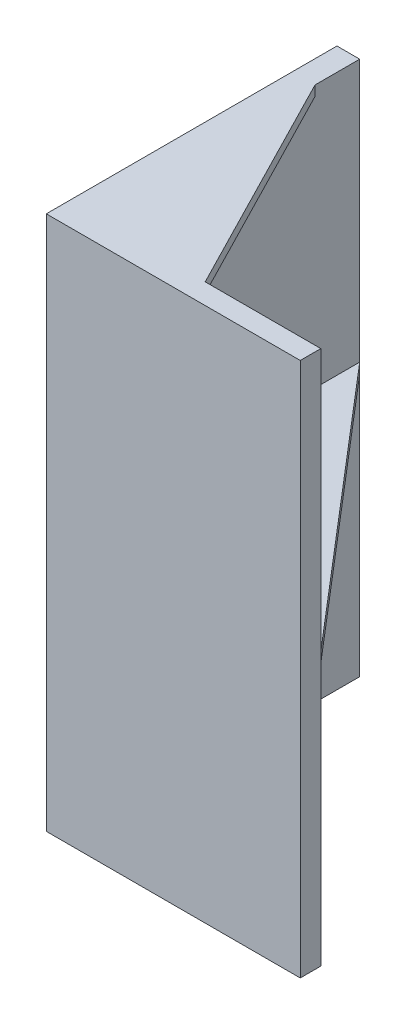
ISO-10303-21;
HEADER;
FILE_DESCRIPTION(('STEP AP214'),'2;1');
FILE_NAME('part.step','',(''),(''),'','','');
FILE_SCHEMA(('AUTOMOTIVE_DESIGN { 1 0 10303 214 1 1 1 1 }'));
ENDSEC;
DATA;
#1=APPLICATION_CONTEXT('core data for automotive mechanical design processes');
#2=APPLICATION_PROTOCOL_DEFINITION('international standard','automotive_design',2000,#1);
#3=PRODUCT_CONTEXT('',#1,'mechanical');
#4=PRODUCT('Part','Part','',(#3));
#5=PRODUCT_RELATED_PRODUCT_CATEGORY('part','',(#4));
#6=PRODUCT_DEFINITION_FORMATION('','',#4);
#7=PRODUCT_DEFINITION_CONTEXT('part definition',#1,'design');
#8=PRODUCT_DEFINITION('design','',#6,#7);
#9=PRODUCT_DEFINITION_SHAPE('','',#8);
#10=(LENGTH_UNIT() NAMED_UNIT(*) SI_UNIT(.MILLI.,.METRE.));
#11=(NAMED_UNIT(*) PLANE_ANGLE_UNIT() SI_UNIT($,.RADIAN.));
#12=(NAMED_UNIT(*) SI_UNIT($,.STERADIAN.) SOLID_ANGLE_UNIT());
#13=UNCERTAINTY_MEASURE_WITH_UNIT(LENGTH_MEASURE(1.E-05),#10,'distance_accuracy_value','');
#14=(GEOMETRIC_REPRESENTATION_CONTEXT(3) GLOBAL_UNCERTAINTY_ASSIGNED_CONTEXT((#13)) GLOBAL_UNIT_ASSIGNED_CONTEXT((#10,
#11,#12)) REPRESENTATION_CONTEXT('',''));
#15=CARTESIAN_POINT('',(0.,0.,0.));
#16=DIRECTION('',(0.,0.,1.));
#17=DIRECTION('',(1.,0.,0.));
#18=AXIS2_PLACEMENT_3D('',#15,#16,#17);
#19=CARTESIAN_POINT('',(0.,-135.89,-77.9555013680354));
#20=DIRECTION('',(1.,0.,0.));
#21=DIRECTION('',(0.,0.,-1.));
#22=AXIS2_PLACEMENT_3D('',#19,#20,#21);
#23=PLANE('',#22);
#24=DIRECTION('',(0.,1.,0.));
#25=VECTOR('',#24,1.);
#26=CARTESIAN_POINT('',(0.,-135.89,-77.9555013680354));
#27=LINE('',#26,#25);
#28=CARTESIAN_POINT('',(0.,-135.89,-77.9555013680354));
#29=VERTEX_POINT('',#28);
#30=CARTESIAN_POINT('',(0.,-2.53999999999999,-77.9555013680354));
#31=VERTEX_POINT('',#30);
#32=EDGE_CURVE('E42',#29,#31,#27,.T.);
#33=ORIENTED_EDGE('',*,*,#32,.T.);
#34=DIRECTION('',(0.,0.,1.));
#35=VECTOR('',#34,1.);
#36=CARTESIAN_POINT('',(0.,-2.53999999999999,-77.9555013680354));
#37=LINE('',#36,#35);
#38=CARTESIAN_POINT('',(0.,-2.53999999999999,59.3058598924289));
#39=VERTEX_POINT('',#38);
#40=EDGE_CURVE('E118',#31,#39,#37,.T.);
#41=ORIENTED_EDGE('',*,*,#40,.T.);
#42=DIRECTION('',(0.,1.,0.));
#43=VECTOR('',#42,1.);
#44=CARTESIAN_POINT('',(0.,-135.89,59.3058598924289));
#45=LINE('',#44,#43);
#46=CARTESIAN_POINT('',(0.,-135.89,59.3058598924289));
#47=VERTEX_POINT('',#46);
#48=EDGE_CURVE('E149',#47,#39,#45,.T.);
#49=ORIENTED_EDGE('',*,*,#48,.F.);
#50=DIRECTION('',(0.,0.,-1.));
#51=VECTOR('',#50,1.);
#52=CARTESIAN_POINT('',(0.,-135.89,-77.9555013680354));
#53=LINE('',#52,#51);
#54=EDGE_CURVE('E146',#47,#29,#53,.T.);
#55=ORIENTED_EDGE('',*,*,#54,.T.);
#56=EDGE_LOOP('',(#33,#41,#49,#55));
#57=FACE_BOUND('',#56,.T.);
#58=ADVANCED_FACE('F33',(#57),#23,.T.);
#59=CARTESIAN_POINT('',(0.,-135.89,59.3058598924289));
#60=DIRECTION('',(0.,0.,-1.));
#61=DIRECTION('',(-1.,0.,0.));
#62=AXIS2_PLACEMENT_3D('',#59,#60,#61);
#63=PLANE('',#62);
#64=ORIENTED_EDGE('',*,*,#48,.T.);
#65=DIRECTION('',(1.,0.,0.));
#66=VECTOR('',#65,1.);
#67=CARTESIAN_POINT('',(0.,-2.53999999999999,59.3058598924289));
#68=LINE('',#67,#66);
#69=CARTESIAN_POINT('',(117.492741296321,-2.53999999999999,59.3058598924289));
#70=VERTEX_POINT('',#69);
#71=EDGE_CURVE('E123',#39,#70,#68,.T.);
#72=ORIENTED_EDGE('',*,*,#71,.T.);
#73=DIRECTION('',(0.,1.,0.));
#74=VECTOR('',#73,1.);
#75=CARTESIAN_POINT('',(117.492741296321,-135.89,59.3058598924289));
#76=LINE('',#75,#74);
#77=CARTESIAN_POINT('',(117.492741296321,-135.89,59.3058598924289));
#78=VERTEX_POINT('',#77);
#79=EDGE_CURVE('E154',#78,#70,#76,.T.);
#80=ORIENTED_EDGE('',*,*,#79,.F.);
#81=DIRECTION('',(-1.,0.,0.));
#82=VECTOR('',#81,1.);
#83=CARTESIAN_POINT('',(0.,-135.89,59.3058598924289));
#84=LINE('',#83,#82);
#85=EDGE_CURVE('E168',#78,#47,#84,.T.);
#86=ORIENTED_EDGE('',*,*,#85,.T.);
#87=EDGE_LOOP('',(#64,#72,#80,#86));
#88=FACE_BOUND('',#87,.T.);
#89=ADVANCED_FACE('F198',(#88),#63,.T.);
#90=CARTESIAN_POINT('',(-11.5627777148761,-135.89,-77.9555013680354));
#91=DIRECTION('',(0.,0.,-1.));
#92=DIRECTION('',(-1.,0.,0.));
#93=AXIS2_PLACEMENT_3D('',#90,#91,#92);
#94=PLANE('',#93);
#95=CARTESIAN_POINT('',(0.,2.53999999999999,-77.9555013680354));
#96=VERTEX_POINT('',#95);
#97=CARTESIAN_POINT('',(0.,135.89,-77.9555013680354));
#98=VERTEX_POINT('',#97);
#99=EDGE_CURVE('E141',#96,#98,#27,.T.);
#100=ORIENTED_EDGE('',*,*,#99,.F.);
#101=DIRECTION('',(0.,-1.,0.));
#102=VECTOR('',#101,1.);
#103=CARTESIAN_POINT('',(0.,-135.89,-77.9555013680354));
#104=LINE('',#103,#102);
#105=EDGE_CURVE('E131',#31,#96,#104,.F.);
#106=ORIENTED_EDGE('',*,*,#105,.F.);
#107=ORIENTED_EDGE('',*,*,#32,.F.);
#108=DIRECTION('',(-1.,0.,0.));
#109=VECTOR('',#108,1.);
#110=CARTESIAN_POINT('',(-11.5627777148761,-135.89,-77.9555013680354));
#111=LINE('',#110,#109);
#112=CARTESIAN_POINT('',(-11.5627777148761,-135.89,-77.9555013680354));
#113=VERTEX_POINT('',#112);
#114=EDGE_CURVE('E162',#29,#113,#111,.T.);
#115=ORIENTED_EDGE('',*,*,#114,.T.);
#116=DIRECTION('',(0.,1.,0.));
#117=VECTOR('',#116,1.);
#118=CARTESIAN_POINT('',(-11.5627777148761,-135.89,-77.9555013680354));
#119=LINE('',#118,#117);
#120=CARTESIAN_POINT('',(-11.5627777148761,135.89,-77.9555013680354));
#121=VERTEX_POINT('',#120);
#122=EDGE_CURVE('E11',#113,#121,#119,.T.);
#123=ORIENTED_EDGE('',*,*,#122,.T.);
#124=DIRECTION('',(-1.,0.,0.));
#125=VECTOR('',#124,1.);
#126=CARTESIAN_POINT('',(-11.5627777148761,135.89,-77.9555013680354));
#127=LINE('',#126,#125);
#128=EDGE_CURVE('E183',#98,#121,#127,.T.);
#129=ORIENTED_EDGE('',*,*,#128,.F.);
#130=EDGE_LOOP('',(#100,#106,#107,#115,#123,#129));
#131=FACE_BOUND('',#130,.T.);
#132=ADVANCED_FACE('F137',(#131),#94,.T.);
#133=DIRECTION('',(0.,0.,1.));
#134=VECTOR('',#133,1.);
#135=CARTESIAN_POINT('',(0.,2.53999999999999,-77.9555013680354));
#136=LINE('',#135,#134);
#137=CARTESIAN_POINT('',(0.,2.53999999999999,59.3058598924289));
#138=VERTEX_POINT('',#137);
#139=EDGE_CURVE('E143',#96,#138,#136,.T.);
#140=ORIENTED_EDGE('',*,*,#139,.F.);
#141=ORIENTED_EDGE('',*,*,#99,.T.);
#142=DIRECTION('',(0.,0.,-1.));
#143=VECTOR('',#142,1.);
#144=CARTESIAN_POINT('',(0.,135.89,-77.9555013680354));
#145=LINE('',#144,#143);
#146=CARTESIAN_POINT('',(0.,135.89,-55.2334176384974));
#147=VERTEX_POINT('',#146);
#148=EDGE_CURVE('E182',#147,#98,#145,.T.);
#149=ORIENTED_EDGE('',*,*,#148,.F.);
#150=DIRECTION('',(0.,-1.,0.));
#151=VECTOR('',#150,1.);
#152=CARTESIAN_POINT('',(0.,-135.89,-55.2334176384974));
#153=LINE('',#152,#151);
#154=CARTESIAN_POINT('',(0.,130.81,-55.2334176384974));
#155=VERTEX_POINT('',#154);
#156=EDGE_CURVE('E246',#155,#147,#153,.F.);
#157=ORIENTED_EDGE('',*,*,#156,.F.);
#158=DIRECTION('',(0.,0.,1.));
#159=VECTOR('',#158,1.);
#160=CARTESIAN_POINT('',(0.,130.81,-77.9555013680354));
#161=LINE('',#160,#159);
#162=CARTESIAN_POINT('',(0.,130.81,59.3058598924289));
#163=VERTEX_POINT('',#162);
#164=EDGE_CURVE('E175',#155,#163,#161,.T.);
#165=ORIENTED_EDGE('',*,*,#164,.T.);
#166=EDGE_CURVE('E153',#138,#163,#45,.T.);
#167=ORIENTED_EDGE('',*,*,#166,.F.);
#168=EDGE_LOOP('',(#140,#141,#149,#157,#165,#167));
#169=FACE_BOUND('',#168,.T.);
#170=ADVANCED_FACE('F219',(#169),#23,.T.);
#171=DIRECTION('',(1.,0.,0.));
#172=VECTOR('',#171,1.);
#173=CARTESIAN_POINT('',(0.,2.53999999999999,59.3058598924289));
#174=LINE('',#173,#172);
#175=CARTESIAN_POINT('',(117.492741296321,2.53999999999999,59.3058598924289));
#176=VERTEX_POINT('',#175);
#177=EDGE_CURVE('E127',#138,#176,#174,.T.);
#178=ORIENTED_EDGE('',*,*,#177,.F.);
#179=ORIENTED_EDGE('',*,*,#166,.T.);
#180=DIRECTION('',(1.,0.,0.));
#181=VECTOR('',#180,1.);
#182=CARTESIAN_POINT('',(0.,130.81,59.3058598924289));
#183=LINE('',#182,#181);
#184=CARTESIAN_POINT('',(58.7463706481607,130.81,59.3058598924289));
#185=VERTEX_POINT('',#184);
#186=EDGE_CURVE('E247',#163,#185,#183,.T.);
#187=ORIENTED_EDGE('',*,*,#186,.T.);
#188=DIRECTION('',(0.,1.,0.));
#189=VECTOR('',#188,1.);
#190=CARTESIAN_POINT('',(58.7463706481607,-135.89,59.3058598924289));
#191=LINE('',#190,#189);
#192=CARTESIAN_POINT('',(58.7463706481607,135.89,59.3058598924289));
#193=VERTEX_POINT('',#192);
#194=EDGE_CURVE('E242',#193,#185,#191,.F.);
#195=ORIENTED_EDGE('',*,*,#194,.F.);
#196=DIRECTION('',(-1.,0.,0.));
#197=VECTOR('',#196,1.);
#198=CARTESIAN_POINT('',(0.,135.89,59.3058598924289));
#199=LINE('',#198,#197);
#200=CARTESIAN_POINT('',(117.492741296321,135.89,59.3058598924289));
#201=VERTEX_POINT('',#200);
#202=EDGE_CURVE('E180',#201,#193,#199,.T.);
#203=ORIENTED_EDGE('',*,*,#202,.F.);
#204=EDGE_CURVE('E156',#176,#201,#76,.T.);
#205=ORIENTED_EDGE('',*,*,#204,.F.);
#206=EDGE_LOOP('',(#178,#179,#187,#195,#203,#205));
#207=FACE_BOUND('',#206,.T.);
#208=ADVANCED_FACE('F215',(#207),#63,.T.);
#209=CARTESIAN_POINT('',(117.492741296321,-135.89,59.3058598924289));
#210=DIRECTION('',(1.,0.,0.));
#211=DIRECTION('',(0.,0.,-1.));
#212=AXIS2_PLACEMENT_3D('',#209,#210,#211);
#213=PLANE('',#212);
#214=DIRECTION('',(0.,0.,-1.));
#215=VECTOR('',#214,1.);
#216=CARTESIAN_POINT('',(117.492741296321,135.89,59.3058598924289));
#217=LINE('',#216,#215);
#218=CARTESIAN_POINT('',(117.492741296321,135.89,69.7496591187686));
#219=VERTEX_POINT('',#218);
#220=EDGE_CURVE('E177',#219,#201,#217,.T.);
#221=ORIENTED_EDGE('',*,*,#220,.F.);
#222=DIRECTION('',(0.,1.,0.));
#223=VECTOR('',#222,1.);
#224=CARTESIAN_POINT('',(117.492741296321,-135.89,69.7496591187686));
#225=LINE('',#224,#223);
#226=CARTESIAN_POINT('',(117.492741296321,-135.89,69.7496591187686));
#227=VERTEX_POINT('',#226);
#228=EDGE_CURVE('E157',#227,#219,#225,.T.);
#229=ORIENTED_EDGE('',*,*,#228,.F.);
#230=DIRECTION('',(0.,0.,-1.));
#231=VECTOR('',#230,1.);
#232=CARTESIAN_POINT('',(117.492741296321,-135.89,59.3058598924289));
#233=LINE('',#232,#231);
#234=EDGE_CURVE('E189',#227,#78,#233,.T.);
#235=ORIENTED_EDGE('',*,*,#234,.T.);
#236=ORIENTED_EDGE('',*,*,#79,.T.);
#237=EDGE_CURVE('E133',#70,#176,#76,.T.);
#238=ORIENTED_EDGE('',*,*,#237,.T.);
#239=ORIENTED_EDGE('',*,*,#204,.T.);
#240=EDGE_LOOP('',(#221,#229,#235,#236,#238,#239));
#241=FACE_BOUND('',#240,.T.);
#242=ADVANCED_FACE('F205',(#241),#213,.T.);
#243=CARTESIAN_POINT('',(-11.5627777148761,-135.89,69.7496591187686));
#244=DIRECTION('',(0.,0.,1.));
#245=DIRECTION('',(1.,0.,0.));
#246=AXIS2_PLACEMENT_3D('',#243,#244,#245);
#247=PLANE('',#246);
#248=DIRECTION('',(1.,0.,0.));
#249=VECTOR('',#248,1.);
#250=CARTESIAN_POINT('',(-11.5627777148761,135.89,69.7496591187686));
#251=LINE('',#250,#249);
#252=CARTESIAN_POINT('',(-11.5627777148761,135.89,69.7496591187686));
#253=VERTEX_POINT('',#252);
#254=EDGE_CURVE('E174',#253,#219,#251,.T.);
#255=ORIENTED_EDGE('',*,*,#254,.F.);
#256=DIRECTION('',(0.,1.,0.));
#257=VECTOR('',#256,1.);
#258=CARTESIAN_POINT('',(-11.5627777148761,-135.89,69.7496591187686));
#259=LINE('',#258,#257);
#260=CARTESIAN_POINT('',(-11.5627777148761,-135.89,69.7496591187686));
#261=VERTEX_POINT('',#260);
#262=EDGE_CURVE('E37',#261,#253,#259,.T.);
#263=ORIENTED_EDGE('',*,*,#262,.F.);
#264=DIRECTION('',(1.,0.,0.));
#265=VECTOR('',#264,1.);
#266=CARTESIAN_POINT('',(-11.5627777148761,-135.89,69.7496591187686));
#267=LINE('',#266,#265);
#268=EDGE_CURVE('E186',#261,#227,#267,.T.);
#269=ORIENTED_EDGE('',*,*,#268,.T.);
#270=ORIENTED_EDGE('',*,*,#228,.T.);
#271=EDGE_LOOP('',(#255,#263,#269,#270));
#272=FACE_BOUND('',#271,.T.);
#273=ADVANCED_FACE('F209',(#272),#247,.T.);
#274=CARTESIAN_POINT('',(-11.5627777148761,-135.89,59.3058598924289));
#275=DIRECTION('',(-1.,0.,0.));
#276=DIRECTION('',(0.,0.,1.));
#277=AXIS2_PLACEMENT_3D('',#274,#275,#276);
#278=PLANE('',#277);
#279=DIRECTION('',(0.,0.,1.));
#280=VECTOR('',#279,1.);
#281=CARTESIAN_POINT('',(-11.5627777148761,135.89,59.3058598924289));
#282=LINE('',#281,#280);
#283=EDGE_CURVE('E172',#121,#253,#282,.T.);
#284=ORIENTED_EDGE('',*,*,#283,.F.);
#285=ORIENTED_EDGE('',*,*,#122,.F.);
#286=DIRECTION('',(0.,0.,1.));
#287=VECTOR('',#286,1.);
#288=CARTESIAN_POINT('',(-11.5627777148761,-135.89,-77.9555013680354));
#289=LINE('',#288,#287);
#290=EDGE_CURVE('E185',#113,#261,#289,.T.);
#291=ORIENTED_EDGE('',*,*,#290,.T.);
#292=ORIENTED_EDGE('',*,*,#262,.T.);
#293=EDGE_LOOP('',(#284,#285,#291,#292));
#294=FACE_BOUND('',#293,.T.);
#295=ADVANCED_FACE('F35',(#294),#278,.T.);
#296=CARTESIAN_POINT('',(0.,-135.89,0.));
#297=DIRECTION('',(0.,1.,0.));
#298=DIRECTION('',(0.,0.,1.));
#299=AXIS2_PLACEMENT_3D('',#296,#297,#298);
#300=PLANE('',#299);
#301=ORIENTED_EDGE('',*,*,#290,.F.);
#302=ORIENTED_EDGE('',*,*,#114,.F.);
#303=ORIENTED_EDGE('',*,*,#54,.F.);
#304=ORIENTED_EDGE('',*,*,#85,.F.);
#305=ORIENTED_EDGE('',*,*,#234,.F.);
#306=ORIENTED_EDGE('',*,*,#268,.F.);
#307=EDGE_LOOP('',(#301,#302,#303,#304,#305,#306));
#308=FACE_BOUND('',#307,.T.);
#309=ADVANCED_FACE('F201',(#308),#300,.F.);
#310=CARTESIAN_POINT('',(0.,135.89,0.));
#311=DIRECTION('',(0.,1.,0.));
#312=DIRECTION('',(0.,0.,1.));
#313=AXIS2_PLACEMENT_3D('',#310,#311,#312);
#314=PLANE('',#313);
#315=ORIENTED_EDGE('',*,*,#202,.T.);
#316=DIRECTION('',(0.456367573520411,0.,0.889791345113613));
#317=VECTOR('',#316,1.);
#318=CARTESIAN_POINT('',(0.,135.89,-55.2334176384974));
#319=LINE('',#318,#317);
#320=EDGE_CURVE('E58',#147,#193,#319,.T.);
#321=ORIENTED_EDGE('',*,*,#320,.F.);
#322=ORIENTED_EDGE('',*,*,#148,.T.);
#323=ORIENTED_EDGE('',*,*,#128,.T.);
#324=ORIENTED_EDGE('',*,*,#283,.T.);
#325=ORIENTED_EDGE('',*,*,#254,.T.);
#326=ORIENTED_EDGE('',*,*,#220,.T.);
#327=EDGE_LOOP('',(#315,#321,#322,#323,#324,#325,#326));
#328=FACE_BOUND('',#327,.T.);
#329=ADVANCED_FACE('F208',(#328),#314,.T.);
#330=CARTESIAN_POINT('',(52.9649817907226,130.81,-4.10292112463344));
#331=DIRECTION('',(0.,1.,0.));
#332=DIRECTION('',(0.,0.,1.));
#333=AXIS2_PLACEMENT_3D('',#330,#331,#332);
#334=PLANE('',#333);
#335=ORIENTED_EDGE('',*,*,#164,.F.);
#336=DIRECTION('',(0.456367573520411,0.,0.889791345113613));
#337=VECTOR('',#336,1.);
#338=CARTESIAN_POINT('',(0.,130.81,-55.2334176384974));
#339=LINE('',#338,#337);
#340=EDGE_CURVE('E142',#155,#185,#339,.T.);
#341=ORIENTED_EDGE('',*,*,#340,.T.);
#342=ORIENTED_EDGE('',*,*,#186,.F.);
#343=EDGE_LOOP('',(#335,#341,#342));
#344=FACE_BOUND('',#343,.T.);
#345=ADVANCED_FACE('F254',(#344),#334,.F.);
#346=CARTESIAN_POINT('',(0.,135.89,-55.2334176384974));
#347=DIRECTION('',(-0.889791345113613,0.,0.456367573520411));
#348=DIRECTION('',(0.456367573520411,0.,0.889791345113613));
#349=AXIS2_PLACEMENT_3D('',#346,#347,#348);
#350=PLANE('',#349);
#351=ORIENTED_EDGE('',*,*,#340,.F.);
#352=ORIENTED_EDGE('',*,*,#156,.T.);
#353=ORIENTED_EDGE('',*,*,#320,.T.);
#354=ORIENTED_EDGE('',*,*,#194,.T.);
#355=EDGE_LOOP('',(#351,#352,#353,#354));
#356=FACE_BOUND('',#355,.T.);
#357=ADVANCED_FACE('F256',(#356),#350,.F.);
#358=CARTESIAN_POINT('',(0.,0.,-77.9555013680354));
#359=DIRECTION('',(-0.759693594896254,0.,0.650281202153043));
#360=DIRECTION('',(0.650281202153043,0.,0.759693594896253));
#361=AXIS2_PLACEMENT_3D('',#358,#359,#360);
#362=PLANE('',#361);
#363=DIRECTION('',(0.650281202153043,0.,0.759693594896253));
#364=VECTOR('',#363,1.);
#365=CARTESIAN_POINT('',(0.,-2.54,-77.9555013680354));
#366=LINE('',#365,#364);
#367=EDGE_CURVE('E121',#31,#70,#366,.T.);
#368=ORIENTED_EDGE('',*,*,#367,.F.);
#369=ORIENTED_EDGE('',*,*,#105,.T.);
#370=DIRECTION('',(0.650281202153043,0.,0.759693594896253));
#371=VECTOR('',#370,1.);
#372=CARTESIAN_POINT('',(0.,2.54,-77.9555013680354));
#373=LINE('',#372,#371);
#374=EDGE_CURVE('E50',#96,#176,#373,.T.);
#375=ORIENTED_EDGE('',*,*,#374,.T.);
#376=ORIENTED_EDGE('',*,*,#237,.F.);
#377=EDGE_LOOP('',(#368,#369,#375,#376));
#378=FACE_BOUND('',#377,.T.);
#379=ADVANCED_FACE('F130',(#378),#362,.F.);
#380=CARTESIAN_POINT('',(52.9649817907226,2.54,-4.10292112463344));
#381=DIRECTION('',(0.,1.,0.));
#382=DIRECTION('',(0.,0.,1.));
#383=AXIS2_PLACEMENT_3D('',#380,#381,#382);
#384=PLANE('',#383);
#385=ORIENTED_EDGE('',*,*,#374,.F.);
#386=ORIENTED_EDGE('',*,*,#139,.T.);
#387=ORIENTED_EDGE('',*,*,#177,.T.);
#388=EDGE_LOOP('',(#385,#386,#387));
#389=FACE_BOUND('',#388,.T.);
#390=ADVANCED_FACE('F257',(#389),#384,.T.);
#391=CARTESIAN_POINT('',(52.9649817907226,-2.54,-4.10292112463344));
#392=DIRECTION('',(0.,1.,0.));
#393=DIRECTION('',(0.,0.,1.));
#394=AXIS2_PLACEMENT_3D('',#391,#392,#393);
#395=PLANE('',#394);
#396=ORIENTED_EDGE('',*,*,#40,.F.);
#397=ORIENTED_EDGE('',*,*,#367,.T.);
#398=ORIENTED_EDGE('',*,*,#71,.F.);
#399=EDGE_LOOP('',(#396,#397,#398));
#400=FACE_BOUND('',#399,.T.);
#401=ADVANCED_FACE('F120',(#400),#395,.F.);
#402=CLOSED_SHELL('',(#58,#89,#132,#170,#208,#242,#273,#295,#309,#329,#345,#357,#379,#390,#401));
#403=MANIFOLD_SOLID_BREP('B2',#402);
#404=ADVANCED_BREP_SHAPE_REPRESENTATION('',(#18,#403),#14);
#405=SHAPE_DEFINITION_REPRESENTATION(#9,#404);
ENDSEC;
END-ISO-10303-21;
